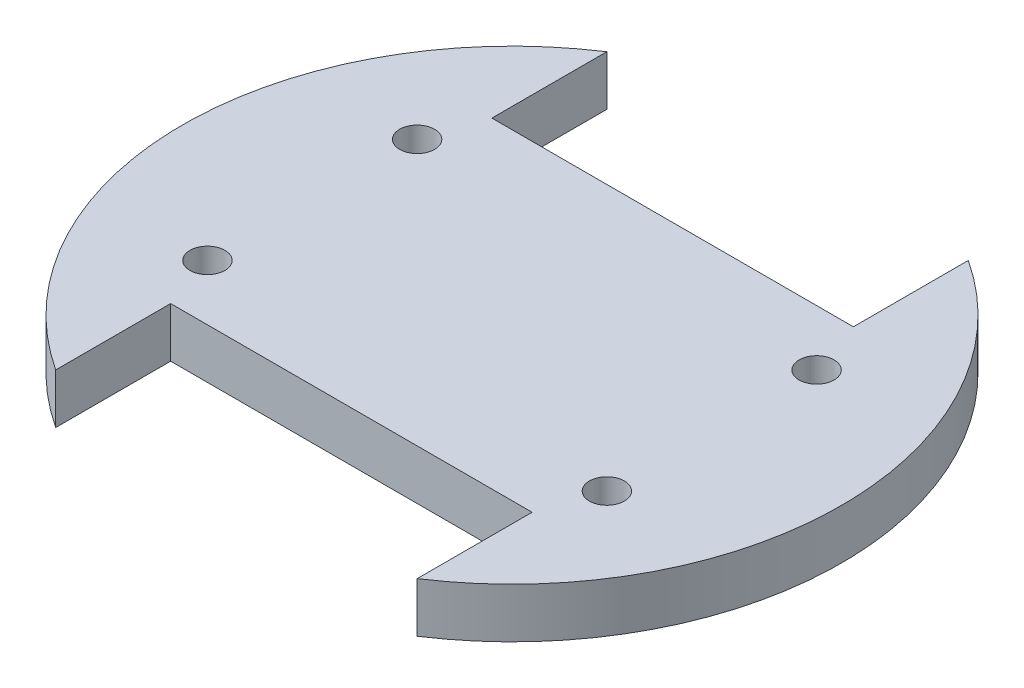
ISO-10303-21;
HEADER;
FILE_DESCRIPTION(('STEP AP214'),'2;1');
FILE_NAME('part.step','',(''),(''),'','','');
FILE_SCHEMA(('AUTOMOTIVE_DESIGN { 1 0 10303 214 1 1 1 1 }'));
ENDSEC;
DATA;
#1=APPLICATION_CONTEXT('core data for automotive mechanical design processes');
#2=APPLICATION_PROTOCOL_DEFINITION('international standard','automotive_design',2000,#1);
#3=PRODUCT_CONTEXT('',#1,'mechanical');
#4=PRODUCT('Part','Part','',(#3));
#5=PRODUCT_RELATED_PRODUCT_CATEGORY('part','',(#4));
#6=PRODUCT_DEFINITION_FORMATION('','',#4);
#7=PRODUCT_DEFINITION_CONTEXT('part definition',#1,'design');
#8=PRODUCT_DEFINITION('design','',#6,#7);
#9=PRODUCT_DEFINITION_SHAPE('','',#8);
#10=(LENGTH_UNIT() NAMED_UNIT(*) SI_UNIT(.MILLI.,.METRE.));
#11=(NAMED_UNIT(*) PLANE_ANGLE_UNIT() SI_UNIT($,.RADIAN.));
#12=(NAMED_UNIT(*) SI_UNIT($,.STERADIAN.) SOLID_ANGLE_UNIT());
#13=UNCERTAINTY_MEASURE_WITH_UNIT(LENGTH_MEASURE(1.E-05),#10,'distance_accuracy_value','');
#14=(GEOMETRIC_REPRESENTATION_CONTEXT(3) GLOBAL_UNCERTAINTY_ASSIGNED_CONTEXT((#13)) GLOBAL_UNIT_ASSIGNED_CONTEXT((#10,
#11,#12)) REPRESENTATION_CONTEXT('',''));
#15=CARTESIAN_POINT('',(0.,0.,0.));
#16=DIRECTION('',(0.,0.,1.));
#17=DIRECTION('',(1.,0.,0.));
#18=AXIS2_PLACEMENT_3D('',#15,#16,#17);
#19=CARTESIAN_POINT('',(0.,5.,0.));
#20=DIRECTION('',(0.,-1.,0.));
#21=DIRECTION('',(0.,0.,-1.));
#22=AXIS2_PLACEMENT_3D('',#19,#20,#21);
#23=CYLINDRICAL_SURFACE('',#22,33.);
#24=CARTESIAN_POINT('',(0.,5.,0.));
#25=DIRECTION('',(0.,1.,0.));
#26=DIRECTION('',(0.,0.,1.));
#27=AXIS2_PLACEMENT_3D('',#24,#25,#26);
#28=CIRCLE('',#27,33.);
#29=CARTESIAN_POINT('',(18.0996729959674,5.,27.5935107849481));
#30=VERTEX_POINT('',#29);
#31=CARTESIAN_POINT('',(18.0996729959676,5.,-27.593510784948));
#32=VERTEX_POINT('',#31);
#33=EDGE_CURVE('E131',#30,#32,#28,.T.);
#34=ORIENTED_EDGE('',*,*,#33,.F.);
#35=DIRECTION('',(0.,-1.,0.));
#36=VECTOR('',#35,1.);
#37=CARTESIAN_POINT('',(18.0996729959674,5.,27.5935107849481));
#38=LINE('',#37,#36);
#39=CARTESIAN_POINT('',(18.0996729959674,0.,27.5935107849481));
#40=VERTEX_POINT('',#39);
#41=EDGE_CURVE('E134',#30,#40,#38,.T.);
#42=ORIENTED_EDGE('',*,*,#41,.T.);
#43=CARTESIAN_POINT('',(0.,0.,0.));
#44=DIRECTION('',(0.,1.,0.));
#45=DIRECTION('',(0.,0.,1.));
#46=AXIS2_PLACEMENT_3D('',#43,#44,#45);
#47=CIRCLE('',#46,33.);
#48=CARTESIAN_POINT('',(18.0996729959676,0.,-27.593510784948));
#49=VERTEX_POINT('',#48);
#50=EDGE_CURVE('E123',#40,#49,#47,.T.);
#51=ORIENTED_EDGE('',*,*,#50,.T.);
#52=DIRECTION('',(0.,-1.,0.));
#53=VECTOR('',#52,1.);
#54=CARTESIAN_POINT('',(18.0996729959676,5.,-27.593510784948));
#55=LINE('',#54,#53);
#56=EDGE_CURVE('E145',#49,#32,#55,.F.);
#57=ORIENTED_EDGE('',*,*,#56,.T.);
#58=EDGE_LOOP('',(#34,#42,#51,#57));
#59=FACE_BOUND('',#58,.T.);
#60=ADVANCED_FACE('F39',(#59),#23,.T.);
#61=CARTESIAN_POINT('',(-18.0996729959672,0.,-27.5935107849483));
#62=VERTEX_POINT('',#61);
#63=CARTESIAN_POINT('',(-18.0996729959674,0.,27.5935107849481));
#64=VERTEX_POINT('',#63);
#65=EDGE_CURVE('E128',#62,#64,#47,.T.);
#66=ORIENTED_EDGE('',*,*,#65,.T.);
#67=DIRECTION('',(0.,-1.,0.));
#68=VECTOR('',#67,1.);
#69=CARTESIAN_POINT('',(-18.0996729959674,5.,27.5935107849481));
#70=LINE('',#69,#68);
#71=CARTESIAN_POINT('',(-18.0996729959674,5.,27.5935107849481));
#72=VERTEX_POINT('',#71);
#73=EDGE_CURVE('E149',#64,#72,#70,.F.);
#74=ORIENTED_EDGE('',*,*,#73,.T.);
#75=CARTESIAN_POINT('',(-18.0996729959672,5.,-27.5935107849483));
#76=VERTEX_POINT('',#75);
#77=EDGE_CURVE('E127',#76,#72,#28,.T.);
#78=ORIENTED_EDGE('',*,*,#77,.F.);
#79=DIRECTION('',(0.,-1.,0.));
#80=VECTOR('',#79,1.);
#81=CARTESIAN_POINT('',(-18.0996729959672,5.,-27.5935107849483));
#82=LINE('',#81,#80);
#83=EDGE_CURVE('E146',#76,#62,#82,.T.);
#84=ORIENTED_EDGE('',*,*,#83,.T.);
#85=EDGE_LOOP('',(#66,#74,#78,#84));
#86=FACE_BOUND('',#85,.T.);
#87=ADVANCED_FACE('F41',(#86),#23,.T.);
#88=CARTESIAN_POINT('',(0.,5.,0.));
#89=DIRECTION('',(0.,1.,0.));
#90=DIRECTION('',(0.,0.,1.));
#91=AXIS2_PLACEMENT_3D('',#88,#89,#90);
#92=PLANE('',#91);
#93=CARTESIAN_POINT('',(20.,5.,-10.5));
#94=DIRECTION('',(0.,1.,0.));
#95=DIRECTION('',(0.,0.,1.));
#96=AXIS2_PLACEMENT_3D('',#93,#94,#95);
#97=CIRCLE('',#96,1.75);
#98=CARTESIAN_POINT('',(20.,5.,-8.75));
#99=VERTEX_POINT('',#98);
#100=EDGE_CURVE('E209',#99,#99,#97,.T.);
#101=ORIENTED_EDGE('',*,*,#100,.F.);
#102=EDGE_LOOP('',(#101));
#103=FACE_BOUND('',#102,.T.);
#104=CARTESIAN_POINT('',(-20.,5.,10.5));
#105=DIRECTION('',(0.,1.,0.));
#106=DIRECTION('',(0.,0.,1.));
#107=AXIS2_PLACEMENT_3D('',#104,#105,#106);
#108=CIRCLE('',#107,1.75);
#109=CARTESIAN_POINT('',(-20.,5.,12.25));
#110=VERTEX_POINT('',#109);
#111=EDGE_CURVE('E213',#110,#110,#108,.T.);
#112=ORIENTED_EDGE('',*,*,#111,.F.);
#113=EDGE_LOOP('',(#112));
#114=FACE_BOUND('',#113,.T.);
#115=CARTESIAN_POINT('',(20.,5.,10.5));
#116=DIRECTION('',(0.,1.,0.));
#117=DIRECTION('',(0.,0.,1.));
#118=AXIS2_PLACEMENT_3D('',#115,#116,#117);
#119=CIRCLE('',#118,1.75);
#120=CARTESIAN_POINT('',(20.,5.,12.25));
#121=VERTEX_POINT('',#120);
#122=EDGE_CURVE('E217',#121,#121,#119,.T.);
#123=ORIENTED_EDGE('',*,*,#122,.F.);
#124=EDGE_LOOP('',(#123));
#125=FACE_BOUND('',#124,.T.);
#126=CARTESIAN_POINT('',(-20.,5.,-10.5));
#127=DIRECTION('',(0.,1.,0.));
#128=DIRECTION('',(0.,0.,1.));
#129=AXIS2_PLACEMENT_3D('',#126,#127,#128);
#130=CIRCLE('',#129,1.75);
#131=CARTESIAN_POINT('',(-20.,5.,-8.75));
#132=VERTEX_POINT('',#131);
#133=EDGE_CURVE('E220',#132,#132,#130,.T.);
#134=ORIENTED_EDGE('',*,*,#133,.F.);
#135=EDGE_LOOP('',(#134));
#136=FACE_BOUND('',#135,.T.);
#137=DIRECTION('',(0.,0.,-1.));
#138=VECTOR('',#137,1.);
#139=CARTESIAN_POINT('',(18.0996729959674,5.,44.9891483422157));
#140=LINE('',#139,#138);
#141=CARTESIAN_POINT('',(18.0996729959674,5.,16.0846974610322));
#142=VERTEX_POINT('',#141);
#143=EDGE_CURVE('E108',#30,#142,#140,.T.);
#144=ORIENTED_EDGE('',*,*,#143,.F.);
#145=ORIENTED_EDGE('',*,*,#33,.T.);
#146=DIRECTION('',(0.,0.,-1.));
#147=VECTOR('',#146,1.);
#148=CARTESIAN_POINT('',(18.0996729959678,5.,-44.9891483422155));
#149=LINE('',#148,#147);
#150=CARTESIAN_POINT('',(18.0996729959675,5.,-16.0846974610321));
#151=VERTEX_POINT('',#150);
#152=EDGE_CURVE('E144',#151,#32,#149,.T.);
#153=ORIENTED_EDGE('',*,*,#152,.F.);
#154=DIRECTION('',(1.,0.,0.));
#155=VECTOR('',#154,1.);
#156=CARTESIAN_POINT('',(18.0996729959675,5.,-16.0846974610321));
#157=LINE('',#156,#155);
#158=CARTESIAN_POINT('',(-18.0996729959673,5.,-16.0846974610324));
#159=VERTEX_POINT('',#158);
#160=EDGE_CURVE('E163',#159,#151,#157,.T.);
#161=ORIENTED_EDGE('',*,*,#160,.F.);
#162=DIRECTION('',(0.,0.,1.));
#163=VECTOR('',#162,1.);
#164=CARTESIAN_POINT('',(-18.0996729959671,5.,-44.9891483422158));
#165=LINE('',#164,#163);
#166=EDGE_CURVE('E161',#76,#159,#165,.T.);
#167=ORIENTED_EDGE('',*,*,#166,.F.);
#168=ORIENTED_EDGE('',*,*,#77,.T.);
#169=DIRECTION('',(0.,0.,1.));
#170=VECTOR('',#169,1.);
#171=CARTESIAN_POINT('',(-18.0996729959674,5.,44.9891483422157));
#172=LINE('',#171,#170);
#173=CARTESIAN_POINT('',(-18.0996729959674,5.,16.0846974610322));
#174=VERTEX_POINT('',#173);
#175=EDGE_CURVE('E118',#174,#72,#172,.T.);
#176=ORIENTED_EDGE('',*,*,#175,.F.);
#177=DIRECTION('',(-1.,0.,0.));
#178=VECTOR('',#177,1.);
#179=CARTESIAN_POINT('',(-18.0996729959674,5.,16.0846974610322));
#180=LINE('',#179,#178);
#181=EDGE_CURVE('E167',#142,#174,#180,.T.);
#182=ORIENTED_EDGE('',*,*,#181,.F.);
#183=EDGE_LOOP('',(#144,#145,#153,#161,#167,#168,#176,#182));
#184=FACE_BOUND('',#183,.T.);
#185=ADVANCED_FACE('F142',(#103,#114,#125,#136,#184),#92,.T.);
#186=CARTESIAN_POINT('',(0.,0.,0.));
#187=DIRECTION('',(0.,1.,0.));
#188=DIRECTION('',(0.,0.,1.));
#189=AXIS2_PLACEMENT_3D('',#186,#187,#188);
#190=PLANE('',#189);
#191=CARTESIAN_POINT('',(20.,0.,-10.5));
#192=DIRECTION('',(0.,1.,0.));
#193=DIRECTION('',(0.,0.,1.));
#194=AXIS2_PLACEMENT_3D('',#191,#192,#193);
#195=CIRCLE('',#194,1.75);
#196=CARTESIAN_POINT('',(20.,0.,-8.75));
#197=VERTEX_POINT('',#196);
#198=EDGE_CURVE('E225',#197,#197,#195,.T.);
#199=ORIENTED_EDGE('',*,*,#198,.T.);
#200=EDGE_LOOP('',(#199));
#201=FACE_BOUND('',#200,.T.);
#202=CARTESIAN_POINT('',(-20.,0.,10.5));
#203=DIRECTION('',(0.,1.,0.));
#204=DIRECTION('',(0.,0.,1.));
#205=AXIS2_PLACEMENT_3D('',#202,#203,#204);
#206=CIRCLE('',#205,1.75);
#207=CARTESIAN_POINT('',(-20.,0.,12.25));
#208=VERTEX_POINT('',#207);
#209=EDGE_CURVE('E312',#208,#208,#206,.T.);
#210=ORIENTED_EDGE('',*,*,#209,.T.);
#211=EDGE_LOOP('',(#210));
#212=FACE_BOUND('',#211,.T.);
#213=CARTESIAN_POINT('',(20.,0.,10.5));
#214=DIRECTION('',(0.,1.,0.));
#215=DIRECTION('',(0.,0.,1.));
#216=AXIS2_PLACEMENT_3D('',#213,#214,#215);
#217=CIRCLE('',#216,1.75);
#218=CARTESIAN_POINT('',(20.,0.,12.25));
#219=VERTEX_POINT('',#218);
#220=EDGE_CURVE('E318',#219,#219,#217,.T.);
#221=ORIENTED_EDGE('',*,*,#220,.T.);
#222=EDGE_LOOP('',(#221));
#223=FACE_BOUND('',#222,.T.);
#224=CARTESIAN_POINT('',(-20.,0.,-10.5));
#225=DIRECTION('',(0.,1.,0.));
#226=DIRECTION('',(0.,0.,1.));
#227=AXIS2_PLACEMENT_3D('',#224,#225,#226);
#228=CIRCLE('',#227,1.75);
#229=CARTESIAN_POINT('',(-20.,0.,-8.75));
#230=VERTEX_POINT('',#229);
#231=EDGE_CURVE('E176',#230,#230,#228,.T.);
#232=ORIENTED_EDGE('',*,*,#231,.T.);
#233=EDGE_LOOP('',(#232));
#234=FACE_BOUND('',#233,.T.);
#235=ORIENTED_EDGE('',*,*,#50,.F.);
#236=DIRECTION('',(0.,0.,-1.));
#237=VECTOR('',#236,1.);
#238=CARTESIAN_POINT('',(18.0996729959674,0.,0.));
#239=LINE('',#238,#237);
#240=CARTESIAN_POINT('',(18.0996729959674,0.,16.0846974610322));
#241=VERTEX_POINT('',#240);
#242=EDGE_CURVE('E11',#40,#241,#239,.T.);
#243=ORIENTED_EDGE('',*,*,#242,.T.);
#244=DIRECTION('',(-1.,0.,0.));
#245=VECTOR('',#244,1.);
#246=CARTESIAN_POINT('',(-18.0996729959674,0.,16.0846974610322));
#247=LINE('',#246,#245);
#248=CARTESIAN_POINT('',(-18.0996729959674,0.,16.0846974610322));
#249=VERTEX_POINT('',#248);
#250=EDGE_CURVE('E115',#241,#249,#247,.T.);
#251=ORIENTED_EDGE('',*,*,#250,.T.);
#252=DIRECTION('',(0.,0.,1.));
#253=VECTOR('',#252,1.);
#254=CARTESIAN_POINT('',(-18.0996729959674,0.,44.9891483422157));
#255=LINE('',#254,#253);
#256=EDGE_CURVE('E54',#249,#64,#255,.T.);
#257=ORIENTED_EDGE('',*,*,#256,.T.);
#258=ORIENTED_EDGE('',*,*,#65,.F.);
#259=DIRECTION('',(0.,0.,1.));
#260=VECTOR('',#259,1.);
#261=CARTESIAN_POINT('',(-18.0996729959674,0.,-1.32524474845978E-13));
#262=LINE('',#261,#260);
#263=CARTESIAN_POINT('',(-18.0996729959673,0.,-16.0846974610324));
#264=VERTEX_POINT('',#263);
#265=EDGE_CURVE('E47',#62,#264,#262,.T.);
#266=ORIENTED_EDGE('',*,*,#265,.T.);
#267=DIRECTION('',(1.,0.,0.));
#268=VECTOR('',#267,1.);
#269=CARTESIAN_POINT('',(18.0996729959675,0.,-16.0846974610321));
#270=LINE('',#269,#268);
#271=CARTESIAN_POINT('',(18.0996729959675,0.,-16.0846974610321));
#272=VERTEX_POINT('',#271);
#273=EDGE_CURVE('E153',#264,#272,#270,.T.);
#274=ORIENTED_EDGE('',*,*,#273,.T.);
#275=DIRECTION('',(0.,0.,-1.));
#276=VECTOR('',#275,1.);
#277=CARTESIAN_POINT('',(18.0996729959678,0.,-44.9891483422155));
#278=LINE('',#277,#276);
#279=EDGE_CURVE('E62',#272,#49,#278,.T.);
#280=ORIENTED_EDGE('',*,*,#279,.T.);
#281=EDGE_LOOP('',(#235,#243,#251,#257,#258,#266,#274,#280));
#282=FACE_BOUND('',#281,.T.);
#283=ADVANCED_FACE('F121',(#201,#212,#223,#234,#282),#190,.F.);
#284=CARTESIAN_POINT('',(-18.0996729959671,0.,-44.9891483422158));
#285=DIRECTION('',(-1.,0.,0.));
#286=DIRECTION('',(0.,0.,1.));
#287=AXIS2_PLACEMENT_3D('',#284,#285,#286);
#288=PLANE('',#287);
#289=ORIENTED_EDGE('',*,*,#166,.T.);
#290=DIRECTION('',(0.,1.,0.));
#291=VECTOR('',#290,1.);
#292=CARTESIAN_POINT('',(-18.0996729959673,0.,-16.0846974610324));
#293=LINE('',#292,#291);
#294=EDGE_CURVE('E171',#264,#159,#293,.T.);
#295=ORIENTED_EDGE('',*,*,#294,.F.);
#296=ORIENTED_EDGE('',*,*,#265,.F.);
#297=ORIENTED_EDGE('',*,*,#83,.F.);
#298=EDGE_LOOP('',(#289,#295,#296,#297));
#299=FACE_BOUND('',#298,.T.);
#300=ADVANCED_FACE('F188',(#299),#288,.F.);
#301=CARTESIAN_POINT('',(18.0996729959678,0.,-44.9891483422155));
#302=DIRECTION('',(1.,0.,0.));
#303=DIRECTION('',(0.,0.,-1.));
#304=AXIS2_PLACEMENT_3D('',#301,#302,#303);
#305=PLANE('',#304);
#306=ORIENTED_EDGE('',*,*,#279,.F.);
#307=DIRECTION('',(0.,1.,0.));
#308=VECTOR('',#307,1.);
#309=CARTESIAN_POINT('',(18.0996729959675,0.,-16.0846974610321));
#310=LINE('',#309,#308);
#311=EDGE_CURVE('E172',#272,#151,#310,.T.);
#312=ORIENTED_EDGE('',*,*,#311,.T.);
#313=ORIENTED_EDGE('',*,*,#152,.T.);
#314=ORIENTED_EDGE('',*,*,#56,.F.);
#315=EDGE_LOOP('',(#306,#312,#313,#314));
#316=FACE_BOUND('',#315,.T.);
#317=ADVANCED_FACE('F178',(#316),#305,.F.);
#318=CARTESIAN_POINT('',(18.0996729959675,0.,-16.0846974610321));
#319=DIRECTION('',(0.,0.,1.));
#320=DIRECTION('',(1.,0.,0.));
#321=AXIS2_PLACEMENT_3D('',#318,#319,#320);
#322=PLANE('',#321);
#323=ORIENTED_EDGE('',*,*,#160,.T.);
#324=ORIENTED_EDGE('',*,*,#311,.F.);
#325=ORIENTED_EDGE('',*,*,#273,.F.);
#326=ORIENTED_EDGE('',*,*,#294,.T.);
#327=EDGE_LOOP('',(#323,#324,#325,#326));
#328=FACE_BOUND('',#327,.T.);
#329=ADVANCED_FACE('F179',(#328),#322,.F.);
#330=CARTESIAN_POINT('',(18.0996729959674,0.,44.9891483422157));
#331=DIRECTION('',(1.,0.,0.));
#332=DIRECTION('',(0.,0.,-1.));
#333=AXIS2_PLACEMENT_3D('',#330,#331,#332);
#334=PLANE('',#333);
#335=ORIENTED_EDGE('',*,*,#143,.T.);
#336=DIRECTION('',(0.,1.,0.));
#337=VECTOR('',#336,1.);
#338=CARTESIAN_POINT('',(18.0996729959674,0.,16.0846974610322));
#339=LINE('',#338,#337);
#340=EDGE_CURVE('E103',#241,#142,#339,.T.);
#341=ORIENTED_EDGE('',*,*,#340,.F.);
#342=ORIENTED_EDGE('',*,*,#242,.F.);
#343=ORIENTED_EDGE('',*,*,#41,.F.);
#344=EDGE_LOOP('',(#335,#341,#342,#343));
#345=FACE_BOUND('',#344,.T.);
#346=ADVANCED_FACE('F105',(#345),#334,.F.);
#347=CARTESIAN_POINT('',(-18.0996729959674,0.,44.9891483422157));
#348=DIRECTION('',(-1.,0.,0.));
#349=DIRECTION('',(0.,0.,1.));
#350=AXIS2_PLACEMENT_3D('',#347,#348,#349);
#351=PLANE('',#350);
#352=ORIENTED_EDGE('',*,*,#256,.F.);
#353=DIRECTION('',(0.,1.,0.));
#354=VECTOR('',#353,1.);
#355=CARTESIAN_POINT('',(-18.0996729959674,0.,16.0846974610322));
#356=LINE('',#355,#354);
#357=EDGE_CURVE('E112',#249,#174,#356,.T.);
#358=ORIENTED_EDGE('',*,*,#357,.T.);
#359=ORIENTED_EDGE('',*,*,#175,.T.);
#360=ORIENTED_EDGE('',*,*,#73,.F.);
#361=EDGE_LOOP('',(#352,#358,#359,#360));
#362=FACE_BOUND('',#361,.T.);
#363=ADVANCED_FACE('F186',(#362),#351,.F.);
#364=CARTESIAN_POINT('',(-18.0996729959674,0.,16.0846974610322));
#365=DIRECTION('',(0.,0.,-1.));
#366=DIRECTION('',(-1.,0.,0.));
#367=AXIS2_PLACEMENT_3D('',#364,#365,#366);
#368=PLANE('',#367);
#369=ORIENTED_EDGE('',*,*,#181,.T.);
#370=ORIENTED_EDGE('',*,*,#357,.F.);
#371=ORIENTED_EDGE('',*,*,#250,.F.);
#372=ORIENTED_EDGE('',*,*,#340,.T.);
#373=EDGE_LOOP('',(#369,#370,#371,#372));
#374=FACE_BOUND('',#373,.T.);
#375=ADVANCED_FACE('F116',(#374),#368,.F.);
#376=CARTESIAN_POINT('',(-20.,0.,-10.5));
#377=DIRECTION('',(0.,1.,0.));
#378=DIRECTION('',(0.,0.,1.));
#379=AXIS2_PLACEMENT_3D('',#376,#377,#378);
#380=CYLINDRICAL_SURFACE('',#379,1.75);
#381=ORIENTED_EDGE('',*,*,#231,.F.);
#382=EDGE_LOOP('',(#381));
#383=FACE_BOUND('',#382,.T.);
#384=ORIENTED_EDGE('',*,*,#133,.T.);
#385=EDGE_LOOP('',(#384));
#386=FACE_BOUND('',#385,.T.);
#387=ADVANCED_FACE('F235',(#383,#386),#380,.F.);
#388=CARTESIAN_POINT('',(20.,0.,10.5));
#389=DIRECTION('',(0.,1.,0.));
#390=DIRECTION('',(0.,0.,1.));
#391=AXIS2_PLACEMENT_3D('',#388,#389,#390);
#392=CYLINDRICAL_SURFACE('',#391,1.75);
#393=ORIENTED_EDGE('',*,*,#220,.F.);
#394=EDGE_LOOP('',(#393));
#395=FACE_BOUND('',#394,.T.);
#396=ORIENTED_EDGE('',*,*,#122,.T.);
#397=EDGE_LOOP('',(#396));
#398=FACE_BOUND('',#397,.T.);
#399=ADVANCED_FACE('F277',(#395,#398),#392,.F.);
#400=CARTESIAN_POINT('',(-20.,0.,10.5));
#401=DIRECTION('',(0.,1.,0.));
#402=DIRECTION('',(0.,0.,1.));
#403=AXIS2_PLACEMENT_3D('',#400,#401,#402);
#404=CYLINDRICAL_SURFACE('',#403,1.75);
#405=ORIENTED_EDGE('',*,*,#209,.F.);
#406=EDGE_LOOP('',(#405));
#407=FACE_BOUND('',#406,.T.);
#408=ORIENTED_EDGE('',*,*,#111,.T.);
#409=EDGE_LOOP('',(#408));
#410=FACE_BOUND('',#409,.T.);
#411=ADVANCED_FACE('F286',(#407,#410),#404,.F.);
#412=CARTESIAN_POINT('',(20.,0.,-10.5));
#413=DIRECTION('',(0.,1.,0.));
#414=DIRECTION('',(0.,0.,1.));
#415=AXIS2_PLACEMENT_3D('',#412,#413,#414);
#416=CYLINDRICAL_SURFACE('',#415,1.75);
#417=ORIENTED_EDGE('',*,*,#198,.F.);
#418=EDGE_LOOP('',(#417));
#419=FACE_BOUND('',#418,.T.);
#420=ORIENTED_EDGE('',*,*,#100,.T.);
#421=EDGE_LOOP('',(#420));
#422=FACE_BOUND('',#421,.T.);
#423=ADVANCED_FACE('F296',(#419,#422),#416,.F.);
#424=CLOSED_SHELL('',(#60,#87,#185,#283,#300,#317,#329,#346,#363,#375,#387,#399,#411,#423));
#425=MANIFOLD_SOLID_BREP('B2',#424);
#426=ADVANCED_BREP_SHAPE_REPRESENTATION('',(#18,#425),#14);
#427=SHAPE_DEFINITION_REPRESENTATION(#9,#426);
ENDSEC;
END-ISO-10303-21;
